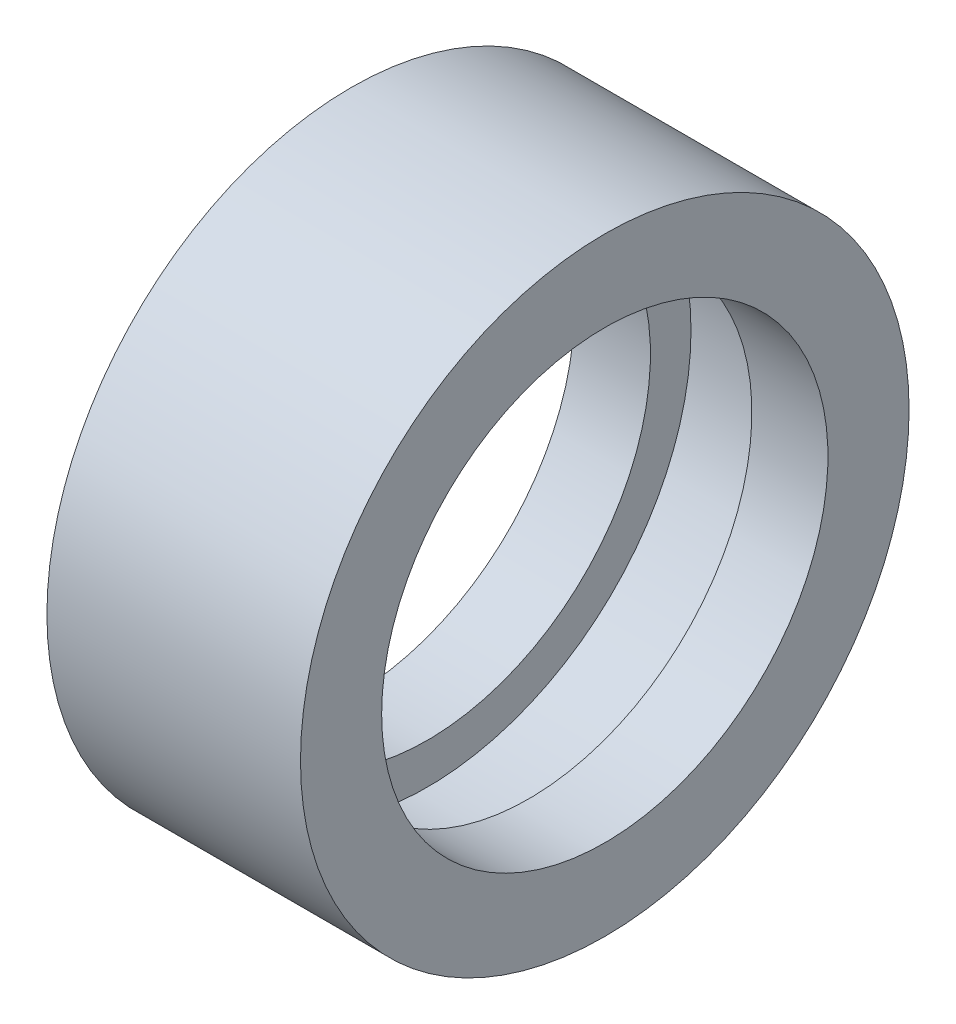
ISO-10303-21;
HEADER;
FILE_DESCRIPTION(('STEP AP214'),'2;1');
FILE_NAME('part.step','',(''),(''),'','','');
FILE_SCHEMA(('AUTOMOTIVE_DESIGN { 1 0 10303 214 1 1 1 1 }'));
ENDSEC;
DATA;
#1=APPLICATION_CONTEXT('core data for automotive mechanical design processes');
#2=APPLICATION_PROTOCOL_DEFINITION('international standard','automotive_design',2000,#1);
#3=PRODUCT_CONTEXT('',#1,'mechanical');
#4=PRODUCT('Part','Part','',(#3));
#5=PRODUCT_RELATED_PRODUCT_CATEGORY('part','',(#4));
#6=PRODUCT_DEFINITION_FORMATION('','',#4);
#7=PRODUCT_DEFINITION_CONTEXT('part definition',#1,'design');
#8=PRODUCT_DEFINITION('design','',#6,#7);
#9=PRODUCT_DEFINITION_SHAPE('','',#8);
#10=(LENGTH_UNIT() NAMED_UNIT(*) SI_UNIT(.MILLI.,.METRE.));
#11=(NAMED_UNIT(*) PLANE_ANGLE_UNIT() SI_UNIT($,.RADIAN.));
#12=(NAMED_UNIT(*) SI_UNIT($,.STERADIAN.) SOLID_ANGLE_UNIT());
#13=UNCERTAINTY_MEASURE_WITH_UNIT(LENGTH_MEASURE(1.E-05),#10,'distance_accuracy_value','');
#14=(GEOMETRIC_REPRESENTATION_CONTEXT(3) GLOBAL_UNCERTAINTY_ASSIGNED_CONTEXT((#13)) GLOBAL_UNIT_ASSIGNED_CONTEXT((#10,
#11,#12)) REPRESENTATION_CONTEXT('',''));
#15=CARTESIAN_POINT('',(0.,0.,0.));
#16=DIRECTION('',(0.,0.,1.));
#17=DIRECTION('',(1.,0.,0.));
#18=AXIS2_PLACEMENT_3D('',#15,#16,#17);
#19=CARTESIAN_POINT('',(-12.5,30.,0.));
#20=DIRECTION('',(1.,0.,0.));
#21=DIRECTION('',(0.,0.,-1.));
#22=AXIS2_PLACEMENT_3D('',#19,#20,#21);
#23=PLANE('',#22);
#24=CARTESIAN_POINT('',(-12.5,0.,0.));
#25=DIRECTION('',(-1.,0.,0.));
#26=DIRECTION('',(0.,0.,1.));
#27=AXIS2_PLACEMENT_3D('',#24,#25,#26);
#28=CIRCLE('',#27,22.);
#29=CARTESIAN_POINT('',(-12.5,0.,22.));
#30=VERTEX_POINT('',#29);
#31=EDGE_CURVE('E10',#30,#30,#28,.T.);
#32=ORIENTED_EDGE('',*,*,#31,.F.);
#33=EDGE_LOOP('',(#32));
#34=FACE_BOUND('',#33,.T.);
#35=CARTESIAN_POINT('',(-12.5,0.,0.));
#36=DIRECTION('',(-1.,0.,0.));
#37=DIRECTION('',(0.,0.,1.));
#38=AXIS2_PLACEMENT_3D('',#35,#36,#37);
#39=CIRCLE('',#38,30.);
#40=CARTESIAN_POINT('',(-12.5,0.,30.));
#41=VERTEX_POINT('',#40);
#42=EDGE_CURVE('E59',#41,#41,#39,.T.);
#43=ORIENTED_EDGE('',*,*,#42,.T.);
#44=EDGE_LOOP('',(#43));
#45=FACE_BOUND('',#44,.T.);
#46=ADVANCED_FACE('F31',(#34,#45),#23,.F.);
#47=CARTESIAN_POINT('',(-51.,0.,0.));
#48=DIRECTION('',(-1.,0.,0.));
#49=DIRECTION('',(0.,0.,1.));
#50=AXIS2_PLACEMENT_3D('',#47,#48,#49);
#51=CYLINDRICAL_SURFACE('',#50,22.);
#52=CARTESIAN_POINT('',(-5.00000000000002,0.,0.));
#53=DIRECTION('',(-1.,0.,0.));
#54=DIRECTION('',(0.,0.,1.));
#55=AXIS2_PLACEMENT_3D('',#52,#53,#54);
#56=CIRCLE('',#55,22.);
#57=CARTESIAN_POINT('',(-5.00000000000002,0.,22.));
#58=VERTEX_POINT('',#57);
#59=EDGE_CURVE('E37',#58,#58,#56,.T.);
#60=ORIENTED_EDGE('',*,*,#59,.F.);
#61=EDGE_LOOP('',(#60));
#62=FACE_BOUND('',#61,.T.);
#63=ORIENTED_EDGE('',*,*,#31,.T.);
#64=EDGE_LOOP('',(#63));
#65=FACE_BOUND('',#64,.T.);
#66=ADVANCED_FACE('F96',(#62,#65),#51,.F.);
#67=CARTESIAN_POINT('',(-5.00000000000002,22.,0.));
#68=DIRECTION('',(-1.,0.,0.));
#69=DIRECTION('',(0.,0.,1.));
#70=AXIS2_PLACEMENT_3D('',#67,#68,#69);
#71=PLANE('',#70);
#72=CARTESIAN_POINT('',(-5.00000000000002,0.,0.));
#73=DIRECTION('',(-1.,0.,0.));
#74=DIRECTION('',(0.,0.,1.));
#75=AXIS2_PLACEMENT_3D('',#72,#73,#74);
#76=CIRCLE('',#75,26.);
#77=CARTESIAN_POINT('',(-5.00000000000002,0.,26.));
#78=VERTEX_POINT('',#77);
#79=EDGE_CURVE('E41',#78,#78,#76,.T.);
#80=ORIENTED_EDGE('',*,*,#79,.F.);
#81=EDGE_LOOP('',(#80));
#82=FACE_BOUND('',#81,.T.);
#83=ORIENTED_EDGE('',*,*,#59,.T.);
#84=EDGE_LOOP('',(#83));
#85=FACE_BOUND('',#84,.T.);
#86=ADVANCED_FACE('F91',(#82,#85),#71,.F.);
#87=CARTESIAN_POINT('',(-51.,0.,0.));
#88=DIRECTION('',(-1.,0.,0.));
#89=DIRECTION('',(0.,0.,1.));
#90=AXIS2_PLACEMENT_3D('',#87,#88,#89);
#91=CYLINDRICAL_SURFACE('',#90,26.);
#92=CARTESIAN_POINT('',(4.99999999999998,0.,0.));
#93=DIRECTION('',(-1.,0.,0.));
#94=DIRECTION('',(0.,0.,1.));
#95=AXIS2_PLACEMENT_3D('',#92,#93,#94);
#96=CIRCLE('',#95,26.);
#97=CARTESIAN_POINT('',(4.99999999999998,0.,26.));
#98=VERTEX_POINT('',#97);
#99=EDGE_CURVE('E45',#98,#98,#96,.T.);
#100=ORIENTED_EDGE('',*,*,#99,.F.);
#101=EDGE_LOOP('',(#100));
#102=FACE_BOUND('',#101,.T.);
#103=ORIENTED_EDGE('',*,*,#79,.T.);
#104=EDGE_LOOP('',(#103));
#105=FACE_BOUND('',#104,.T.);
#106=ADVANCED_FACE('F85',(#102,#105),#91,.F.);
#107=CARTESIAN_POINT('',(4.99999999999998,22.,0.));
#108=DIRECTION('',(1.,0.,0.));
#109=DIRECTION('',(0.,0.,-1.));
#110=AXIS2_PLACEMENT_3D('',#107,#108,#109);
#111=PLANE('',#110);
#112=CARTESIAN_POINT('',(4.99999999999998,0.,0.));
#113=DIRECTION('',(-1.,0.,0.));
#114=DIRECTION('',(0.,0.,1.));
#115=AXIS2_PLACEMENT_3D('',#112,#113,#114);
#116=CIRCLE('',#115,22.);
#117=CARTESIAN_POINT('',(4.99999999999998,0.,22.));
#118=VERTEX_POINT('',#117);
#119=EDGE_CURVE('E50',#118,#118,#116,.T.);
#120=ORIENTED_EDGE('',*,*,#119,.F.);
#121=EDGE_LOOP('',(#120));
#122=FACE_BOUND('',#121,.T.);
#123=ORIENTED_EDGE('',*,*,#99,.T.);
#124=EDGE_LOOP('',(#123));
#125=FACE_BOUND('',#124,.T.);
#126=ADVANCED_FACE('F79',(#122,#125),#111,.F.);
#127=CARTESIAN_POINT('',(-51.,0.,0.));
#128=DIRECTION('',(-1.,0.,0.));
#129=DIRECTION('',(0.,0.,1.));
#130=AXIS2_PLACEMENT_3D('',#127,#128,#129);
#131=CYLINDRICAL_SURFACE('',#130,22.);
#132=CARTESIAN_POINT('',(12.5,0.,0.));
#133=DIRECTION('',(-1.,0.,0.));
#134=DIRECTION('',(0.,0.,1.));
#135=AXIS2_PLACEMENT_3D('',#132,#133,#134);
#136=CIRCLE('',#135,22.);
#137=CARTESIAN_POINT('',(12.5,0.,22.));
#138=VERTEX_POINT('',#137);
#139=EDGE_CURVE('E53',#138,#138,#136,.T.);
#140=ORIENTED_EDGE('',*,*,#139,.F.);
#141=EDGE_LOOP('',(#140));
#142=FACE_BOUND('',#141,.T.);
#143=ORIENTED_EDGE('',*,*,#119,.T.);
#144=EDGE_LOOP('',(#143));
#145=FACE_BOUND('',#144,.T.);
#146=ADVANCED_FACE('F73',(#142,#145),#131,.F.);
#147=CARTESIAN_POINT('',(12.5,30.,0.));
#148=DIRECTION('',(-1.,0.,0.));
#149=DIRECTION('',(0.,0.,1.));
#150=AXIS2_PLACEMENT_3D('',#147,#148,#149);
#151=PLANE('',#150);
#152=CARTESIAN_POINT('',(12.5,0.,0.));
#153=DIRECTION('',(-1.,0.,0.));
#154=DIRECTION('',(0.,0.,1.));
#155=AXIS2_PLACEMENT_3D('',#152,#153,#154);
#156=CIRCLE('',#155,30.);
#157=CARTESIAN_POINT('',(12.5,0.,30.));
#158=VERTEX_POINT('',#157);
#159=EDGE_CURVE('E56',#158,#158,#156,.T.);
#160=ORIENTED_EDGE('',*,*,#159,.F.);
#161=EDGE_LOOP('',(#160));
#162=FACE_BOUND('',#161,.T.);
#163=ORIENTED_EDGE('',*,*,#139,.T.);
#164=EDGE_LOOP('',(#163));
#165=FACE_BOUND('',#164,.T.);
#166=ADVANCED_FACE('F67',(#162,#165),#151,.F.);
#167=CARTESIAN_POINT('',(-51.,0.,0.));
#168=DIRECTION('',(-1.,0.,0.));
#169=DIRECTION('',(0.,0.,1.));
#170=AXIS2_PLACEMENT_3D('',#167,#168,#169);
#171=CYLINDRICAL_SURFACE('',#170,30.);
#172=ORIENTED_EDGE('',*,*,#42,.F.);
#173=EDGE_LOOP('',(#172));
#174=FACE_BOUND('',#173,.T.);
#175=ORIENTED_EDGE('',*,*,#159,.T.);
#176=EDGE_LOOP('',(#175));
#177=FACE_BOUND('',#176,.T.);
#178=ADVANCED_FACE('F64',(#174,#177),#171,.T.);
#179=CLOSED_SHELL('',(#46,#66,#86,#106,#126,#146,#166,#178));
#180=MANIFOLD_SOLID_BREP('B2',#179);
#181=ADVANCED_BREP_SHAPE_REPRESENTATION('',(#18,#180),#14);
#182=SHAPE_DEFINITION_REPRESENTATION(#9,#181);
ENDSEC;
END-ISO-10303-21;
